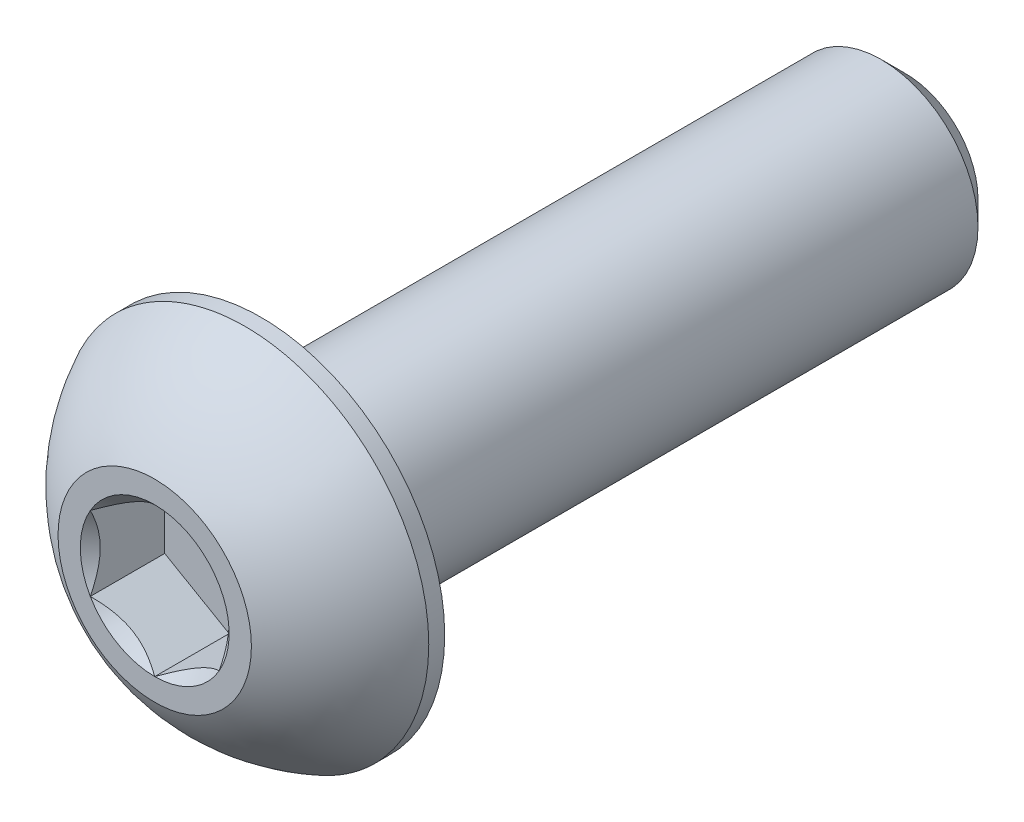
ISO-10303-21;
HEADER;
FILE_DESCRIPTION(('STEP AP214'),'2;1');
FILE_NAME('part.step','',(''),(''),'','','');
FILE_SCHEMA(('AUTOMOTIVE_DESIGN { 1 0 10303 214 1 1 1 1 }'));
ENDSEC;
DATA;
#1=APPLICATION_CONTEXT('core data for automotive mechanical design processes');
#2=APPLICATION_PROTOCOL_DEFINITION('international standard','automotive_design',2000,#1);
#3=PRODUCT_CONTEXT('',#1,'mechanical');
#4=PRODUCT('Part','Part','',(#3));
#5=PRODUCT_RELATED_PRODUCT_CATEGORY('part','',(#4));
#6=PRODUCT_DEFINITION_FORMATION('','',#4);
#7=PRODUCT_DEFINITION_CONTEXT('part definition',#1,'design');
#8=PRODUCT_DEFINITION('design','',#6,#7);
#9=PRODUCT_DEFINITION_SHAPE('','',#8);
#10=(LENGTH_UNIT() NAMED_UNIT(*) SI_UNIT(.MILLI.,.METRE.));
#11=(NAMED_UNIT(*) PLANE_ANGLE_UNIT() SI_UNIT($,.RADIAN.));
#12=(NAMED_UNIT(*) SI_UNIT($,.STERADIAN.) SOLID_ANGLE_UNIT());
#13=UNCERTAINTY_MEASURE_WITH_UNIT(LENGTH_MEASURE(1.E-05),#10,'distance_accuracy_value','');
#14=(GEOMETRIC_REPRESENTATION_CONTEXT(3) GLOBAL_UNCERTAINTY_ASSIGNED_CONTEXT((#13)) GLOBAL_UNIT_ASSIGNED_CONTEXT((#10,
#11,#12)) REPRESENTATION_CONTEXT('',''));
#15=CARTESIAN_POINT('',(0.,0.,0.));
#16=DIRECTION('',(0.,0.,1.));
#17=DIRECTION('',(1.,0.,0.));
#18=AXIS2_PLACEMENT_3D('',#15,#16,#17);
#19=CARTESIAN_POINT('',(1.,-0.57735026919,-1.155));
#20=DIRECTION('',(0.,0.,1.));
#21=DIRECTION('',(1.,0.,0.));
#22=AXIS2_PLACEMENT_3D('',#19,#20,#21);
#23=PLANE('',#22);
#24=DIRECTION('',(0.,-1.,0.));
#25=VECTOR('',#24,1.);
#26=CARTESIAN_POINT('',(-1.,0.57735026919,-1.155));
#27=LINE('',#26,#25);
#28=CARTESIAN_POINT('',(-0.999999999999868,0.57735026918977,-1.155));
#29=VERTEX_POINT('',#28);
#30=CARTESIAN_POINT('',(-1.,-0.57735026919,-1.155));
#31=VERTEX_POINT('',#30);
#32=EDGE_CURVE('E67',#29,#31,#27,.T.);
#33=ORIENTED_EDGE('',*,*,#32,.T.);
#34=DIRECTION('',(0.866025403784329,-0.50000000000019,0.));
#35=VECTOR('',#34,1.);
#36=CARTESIAN_POINT('',(-1.,-0.57735026919,-1.155));
#37=LINE('',#36,#35);
#38=CARTESIAN_POINT('',(-1.32209130071238E-13,-1.15470053837923,-1.155));
#39=VERTEX_POINT('',#38);
#40=EDGE_CURVE('E81',#31,#39,#37,.T.);
#41=ORIENTED_EDGE('',*,*,#40,.T.);
#42=DIRECTION('',(0.866025403784329,0.50000000000019,0.));
#43=VECTOR('',#42,1.);
#44=CARTESIAN_POINT('',(0.,-1.154700538379,-1.155));
#45=LINE('',#44,#43);
#46=CARTESIAN_POINT('',(0.999999999999868,-0.57735026918977,-1.155));
#47=VERTEX_POINT('',#46);
#48=EDGE_CURVE('E84',#39,#47,#45,.T.);
#49=ORIENTED_EDGE('',*,*,#48,.T.);
#50=DIRECTION('',(0.,1.,0.));
#51=VECTOR('',#50,1.);
#52=CARTESIAN_POINT('',(1.,-0.57735026919,-1.155));
#53=LINE('',#52,#51);
#54=CARTESIAN_POINT('',(1.,0.57735026919,-1.155));
#55=VERTEX_POINT('',#54);
#56=EDGE_CURVE('E94',#47,#55,#53,.T.);
#57=ORIENTED_EDGE('',*,*,#56,.T.);
#58=DIRECTION('',(-0.866025403784329,0.50000000000019,0.));
#59=VECTOR('',#58,1.);
#60=CARTESIAN_POINT('',(1.,0.57735026919,-1.155));
#61=LINE('',#60,#59);
#62=CARTESIAN_POINT('',(1.32384013380888E-13,1.15470053837923,-1.155));
#63=VERTEX_POINT('',#62);
#64=EDGE_CURVE('E156',#55,#63,#61,.T.);
#65=ORIENTED_EDGE('',*,*,#64,.T.);
#66=DIRECTION('',(-0.866025403784329,-0.50000000000019,0.));
#67=VECTOR('',#66,1.);
#68=CARTESIAN_POINT('',(0.,1.154700538379,-1.155));
#69=LINE('',#68,#67);
#70=EDGE_CURVE('E72',#63,#29,#69,.T.);
#71=ORIENTED_EDGE('',*,*,#70,.T.);
#72=EDGE_LOOP('',(#33,#41,#49,#57,#65,#71));
#73=FACE_BOUND('',#72,.T.);
#74=ADVANCED_FACE('F17',(#73),#23,.T.);
#75=CARTESIAN_POINT('',(-1.,-0.57735026919,-1.155));
#76=DIRECTION('',(-0.50000000000019,-0.866025403784329,0.));
#77=DIRECTION('',(0.866025403784329,-0.50000000000019,0.));
#78=AXIS2_PLACEMENT_3D('',#75,#76,#77);
#79=PLANE('',#78);
#80=CARTESIAN_POINT('',(-1.00000000000687,-0.577350269186032,-9.76573861725329E-12));
#81=CARTESIAN_POINT('',(-0.965629464441707,-0.597194107146782,-0.0198247003241369));
#82=CARTESIAN_POINT('',(-0.930684324301687,-0.617369693213502,-0.0384849663840303));
#83=CARTESIAN_POINT('',(-0.859427596899556,-0.658509783960715,-0.0726511231288598));
#84=CARTESIAN_POINT('',(-0.823109236818877,-0.679478198929832,-0.0881380100268031));
#85=CARTESIAN_POINT('',(-0.749874902209068,-0.721760061730749,-0.114666959659701));
#86=CARTESIAN_POINT('',(-0.712977570437581,-0.743062746161407,-0.125775687439788));
#87=CARTESIAN_POINT('',(-0.638371399378789,-0.78613663910543,-0.142891513089796));
#88=CARTESIAN_POINT('',(-0.600664836168012,-0.807906533525398,-0.148911380154949));
#89=CARTESIAN_POINT('',(-0.535672283803929,-0.845430001128142,-0.154341115227554));
#90=CARTESIAN_POINT('',(-0.50847069502453,-0.861134845732321,-0.155143433048929));
#91=CARTESIAN_POINT('',(-0.454120291097658,-0.892514066070082,-0.153791220217833));
#92=CARTESIAN_POINT('',(-0.42697148893419,-0.908188434307344,-0.15163603640589));
#93=CARTESIAN_POINT('',(-0.345912971864407,-0.954987590957718,-0.140876680236939));
#94=CARTESIAN_POINT('',(-0.292406762387295,-0.985879415402661,-0.127977491708379));
#95=CARTESIAN_POINT('',(-0.198537260412867,-1.04007499763632,-0.0968623192937564));
#96=CARTESIAN_POINT('',(-0.157732128751787,-1.06363385138517,-0.0802830121814487));
#97=CARTESIAN_POINT('',(-0.077718801117891,-1.10982956763339,-0.0429387149837531));
#98=CARTESIAN_POINT('',(-0.0385058936699848,-1.13246915030415,-0.0221873503351658));
#99=CARTESIAN_POINT('',(6.45503076175351E-12,-1.15470053838365,-9.52687762309462E-12));
#100=B_SPLINE_CURVE_WITH_KNOTS('',3,(#80,#81,#82,#83,#84,#85,#86,#87,#88,#89,#90,#91,#92,#93,
#94,#95,#96,#97,#98,#99),.UNSPECIFIED.,.F.,.F.,(4,2,2,2,2,2,2,2,2,4),(0.,0.133182946614773,
0.267141541534504,0.398973326915738,0.530473323836531,0.624596460627169,0.718740387706706,
0.907081600901655,1.05673041344688,1.20589820621635),.UNSPECIFIED.);
#101=CARTESIAN_POINT('',(-1.00000000000595,-0.577350269193433,-6.86662647432876E-12));
#102=VERTEX_POINT('',#101);
#103=CARTESIAN_POINT('',(-9.04559531445216E-12,-1.15470053838841,-4.76344114464498E-12));
#104=VERTEX_POINT('',#103);
#105=EDGE_CURVE('E20',#102,#104,#100,.T.);
#106=ORIENTED_EDGE('',*,*,#105,.T.);
#107=DIRECTION('',(0.,0.,1.));
#108=VECTOR('',#107,1.);
#109=CARTESIAN_POINT('',(0.,-1.154700538379,-1.155));
#110=LINE('',#109,#108);
#111=EDGE_CURVE('E88',#104,#39,#110,.F.);
#112=ORIENTED_EDGE('',*,*,#111,.T.);
#113=ORIENTED_EDGE('',*,*,#40,.F.);
#114=DIRECTION('',(0.,0.,1.));
#115=VECTOR('',#114,1.);
#116=CARTESIAN_POINT('',(-1.,-0.57735026919,-1.155));
#117=LINE('',#116,#115);
#118=EDGE_CURVE('E59',#31,#102,#117,.T.);
#119=ORIENTED_EDGE('',*,*,#118,.T.);
#120=EDGE_LOOP('',(#106,#112,#113,#119));
#121=FACE_BOUND('',#120,.T.);
#122=ADVANCED_FACE('F89',(#121),#79,.F.);
#123=CARTESIAN_POINT('',(0.,-1.154700538379,-1.155));
#124=DIRECTION('',(0.50000000000019,-0.866025403784329,0.));
#125=DIRECTION('',(0.866025403784329,0.50000000000019,0.));
#126=AXIS2_PLACEMENT_3D('',#123,#124,#125);
#127=PLANE('',#126);
#128=CARTESIAN_POINT('',(-7.14404093326364E-12,-1.15470053838312,-1.00471971558713E-11));
#129=CARTESIAN_POINT('',(0.0343705355580595,-1.13485670042235,-0.0198247003244728));
#130=CARTESIAN_POINT('',(0.069315675698119,-1.11468111435561,-0.0384849663844207));
#131=CARTESIAN_POINT('',(0.140572403100335,-1.07354102360835,-0.0726511231293555));
#132=CARTESIAN_POINT('',(0.176890763181059,-1.05257260863921,-0.0881380100273495));
#133=CARTESIAN_POINT('',(0.250125097790961,-1.01029074583823,-0.114666959660338));
#134=CARTESIAN_POINT('',(0.287022429562496,-0.988988061407549,-0.125775687440465));
#135=CARTESIAN_POINT('',(0.361628600621389,-0.945914168463468,-0.142891513090537));
#136=CARTESIAN_POINT('',(0.399335163832218,-0.924144274043469,-0.148911380155715));
#137=CARTESIAN_POINT('',(0.464327716196336,-0.886620806440705,-0.15434111522834));
#138=CARTESIAN_POINT('',(0.491529304975717,-0.870915961836536,-0.155143433049722));
#139=CARTESIAN_POINT('',(0.545879708902554,-0.839536741498797,-0.153791220218641));
#140=CARTESIAN_POINT('',(0.573028511066004,-0.823862373261545,-0.151636036406705));
#141=CARTESIAN_POINT('',(0.654087028135734,-0.7770632166112,-0.14087668023778));
#142=CARTESIAN_POINT('',(0.707593237612812,-0.746171392166277,-0.127977491709239));
#143=CARTESIAN_POINT('',(0.801462739587241,-0.691975809932617,-0.0968623192946334));
#144=CARTESIAN_POINT('',(0.842267871248352,-0.668416956183745,-0.0802830121823146));
#145=CARTESIAN_POINT('',(0.92228119888231,-0.622221239935498,-0.042938714984587));
#146=CARTESIAN_POINT('',(0.961494106330245,-0.599581657264713,-0.0221873503359786));
#147=CARTESIAN_POINT('',(1.00000000000671,-0.577350269185206,-1.03166856816178E-11));
#148=B_SPLINE_CURVE_WITH_KNOTS('',3,(#128,#129,#130,#131,#132,#133,#134,#135,#136,#137,#138,
#139,#140,#141,#142,#143,#144,#145,#146,#147),.UNSPECIFIED.,.F.,.F.,(4,2,2,2,2,2,2,2,2,4),(0.,
0.133182946614965,0.267141541534896,0.39897332691632,0.530473323837301,0.624596460627876,
0.718740387707351,0.907081600902173,1.05673041344751,1.2058982062171),.UNSPECIFIED.);
#149=CARTESIAN_POINT('',(1.00000000000336,-0.577350269201336,-5.15841129850177E-12));
#150=VERTEX_POINT('',#149);
#151=EDGE_CURVE('E200',#104,#150,#148,.T.);
#152=ORIENTED_EDGE('',*,*,#151,.T.);
#153=DIRECTION('',(0.,0.,-1.));
#154=VECTOR('',#153,1.);
#155=CARTESIAN_POINT('',(1.,-0.57735026919,-1.155));
#156=LINE('',#155,#154);
#157=EDGE_CURVE('E98',#150,#47,#156,.T.);
#158=ORIENTED_EDGE('',*,*,#157,.T.);
#159=ORIENTED_EDGE('',*,*,#48,.F.);
#160=ORIENTED_EDGE('',*,*,#111,.F.);
#161=EDGE_LOOP('',(#152,#158,#159,#160));
#162=FACE_BOUND('',#161,.T.);
#163=ADVANCED_FACE('F96',(#162),#127,.F.);
#164=CARTESIAN_POINT('',(1.,-0.57735026919,-1.155));
#165=DIRECTION('',(1.,0.,0.));
#166=DIRECTION('',(0.,0.,-1.));
#167=AXIS2_PLACEMENT_3D('',#164,#165,#166);
#168=PLANE('',#167);
#169=ORIENTED_EDGE('',*,*,#157,.F.);
#170=CARTESIAN_POINT('',(1.,-0.577350269197873,-9.79657883863577E-12));
#171=CARTESIAN_POINT('',(1.,-0.537921916680572,-0.0196957814667734));
#172=CARTESIAN_POINT('',(1.,-0.497838522924792,-0.0382415234641899));
#173=CARTESIAN_POINT('',(1.,-0.416089218001776,-0.0722362431308401));
#174=CARTESIAN_POINT('',(1.,-0.374414806909283,-0.0876645993592921));
#175=CARTESIAN_POINT('',(1.,-0.28986152287946,-0.114306054614917));
#176=CARTESIAN_POINT('',(1.,-0.246987267534562,-0.125533419411625));
#177=CARTESIAN_POINT('',(1.,-0.160298880506354,-0.1428184328681));
#178=CARTESIAN_POINT('',(1.,-0.116488090628363,-0.148892068105174));
#179=CARTESIAN_POINT('',(1.,-0.0604313808574838,-0.152949365561766));
#180=CARTESIAN_POINT('',(1.,-0.0483511655846584,-0.153605303607655));
#181=CARTESIAN_POINT('',(1.,-0.0241811978040213,-0.154480969382922));
#182=CARTESIAN_POINT('',(1.,-0.0120914540520388,-0.154700934074538));
#183=CARTESIAN_POINT('',(1.,0.0303471731681174,-0.154699545112393));
#184=CARTESIAN_POINT('',(1.,0.0607051197102165,-0.153310476556589));
#185=CARTESIAN_POINT('',(1.,0.121184237368537,-0.147836698539922));
#186=CARTESIAN_POINT('',(1.,0.151305228501232,-0.143750108934114));
#187=CARTESIAN_POINT('',(1.,0.241266773105827,-0.127699537859295));
#188=CARTESIAN_POINT('',(1.,0.300451693371655,-0.111947476554444));
#189=CARTESIAN_POINT('',(1.,0.396054922851829,-0.0797228164968935));
#190=CARTESIAN_POINT('',(1.,0.433252086897934,-0.0653935986061159));
#191=CARTESIAN_POINT('',(1.,0.506237961687203,-0.0343375601574046));
#192=CARTESIAN_POINT('',(1.,0.542036443001901,-0.0176338680725736));
#193=CARTESIAN_POINT('',(1.,0.577350269197935,-9.76588511529571E-12));
#194=B_SPLINE_CURVE_WITH_KNOTS('',3,(#170,#171,#172,#173,#174,#175,#176,#177,#178,#179,#180,
#181,#182,#183,#184,#185,#186,#187,#188,#189,#190,#191,#192,#193),.UNSPECIFIED.,.F.,.F.,(4,2,2,
2,2,2,2,2,2,2,2,4),(0.,0.132313199490098,0.265474890532123,0.398180195021638,0.530472334481848,
0.566760915586624,0.603029767540627,0.694057457520673,0.785148659968771,0.968083578453306,
1.08759246661553,1.20600826493605),.UNSPECIFIED.);
#195=CARTESIAN_POINT('',(1.00000000001189,0.577350269187101,-4.88292132314233E-12));
#196=VERTEX_POINT('',#195);
#197=EDGE_CURVE('E178',#150,#196,#194,.T.);
#198=ORIENTED_EDGE('',*,*,#197,.T.);
#199=DIRECTION('',(0.,0.,1.));
#200=VECTOR('',#199,1.);
#201=CARTESIAN_POINT('',(1.,0.57735026919,-1.155));
#202=LINE('',#201,#200);
#203=EDGE_CURVE('E153',#196,#55,#202,.F.);
#204=ORIENTED_EDGE('',*,*,#203,.T.);
#205=ORIENTED_EDGE('',*,*,#56,.F.);
#206=EDGE_LOOP('',(#169,#198,#204,#205));
#207=FACE_BOUND('',#206,.T.);
#208=ADVANCED_FACE('F177',(#207),#168,.F.);
#209=CARTESIAN_POINT('',(1.,0.57735026919,-1.155));
#210=DIRECTION('',(0.50000000000019,0.866025403784329,0.));
#211=DIRECTION('',(-0.866025403784329,0.50000000000019,0.));
#212=AXIS2_PLACEMENT_3D('',#209,#210,#211);
#213=PLANE('',#212);
#214=CARTESIAN_POINT('',(1.00000000000687,0.577350269186032,-9.76580806181299E-12));
#215=CARTESIAN_POINT('',(0.965629464441707,0.597194107146782,-0.0198247003241369));
#216=CARTESIAN_POINT('',(0.930684324301687,0.617369693213502,-0.0384849663840303));
#217=CARTESIAN_POINT('',(0.859427596899556,0.658509783960715,-0.0726511231288599));
#218=CARTESIAN_POINT('',(0.823109236818877,0.679478198929831,-0.0881380100268032));
#219=CARTESIAN_POINT('',(0.749874902209068,0.721760061730749,-0.114666959659701));
#220=CARTESIAN_POINT('',(0.712977570437581,0.743062746161407,-0.125775687439788));
#221=CARTESIAN_POINT('',(0.638371399378789,0.78613663910543,-0.142891513089796));
#222=CARTESIAN_POINT('',(0.600664836168013,0.807906533525398,-0.148911380154949));
#223=CARTESIAN_POINT('',(0.535672283803929,0.845430001128141,-0.154341115227554));
#224=CARTESIAN_POINT('',(0.508470695024531,0.861134845732321,-0.155143433048929));
#225=CARTESIAN_POINT('',(0.454120291097659,0.892514066070081,-0.153791220217833));
#226=CARTESIAN_POINT('',(0.426971488934191,0.908188434307343,-0.15163603640589));
#227=CARTESIAN_POINT('',(0.345912971864408,0.954987590957718,-0.140876680236939));
#228=CARTESIAN_POINT('',(0.292406762387296,0.985879415402661,-0.127977491708379));
#229=CARTESIAN_POINT('',(0.198537260412867,1.04007499763632,-0.0968623192937566));
#230=CARTESIAN_POINT('',(0.157732128751788,1.06363385138517,-0.0802830121814489));
#231=CARTESIAN_POINT('',(0.0777188011178913,1.10982956763339,-0.0429387149837533));
#232=CARTESIAN_POINT('',(0.0385058936699849,1.13246915030415,-0.0221873503351659));
#233=CARTESIAN_POINT('',(-6.4549741089323E-12,1.15470053838365,-9.52687788960817E-12));
#234=B_SPLINE_CURVE_WITH_KNOTS('',3,(#214,#215,#216,#217,#218,#219,#220,#221,#222,#223,#224,
#225,#226,#227,#228,#229,#230,#231,#232,#233),.UNSPECIFIED.,.F.,.F.,(4,2,2,2,2,2,2,2,2,4),(0.,
0.133182946614772,0.267141541534504,0.398973326915737,0.53047332383653,0.624596460627168,
0.718740387706705,0.907081600901654,1.05673041344688,1.20589820621635),.UNSPECIFIED.);
#235=CARTESIAN_POINT('',(9.0455729964461E-12,1.15470053838841,-4.7634775212635E-12));
#236=VERTEX_POINT('',#235);
#237=EDGE_CURVE('E183',#196,#236,#234,.T.);
#238=ORIENTED_EDGE('',*,*,#237,.T.);
#239=DIRECTION('',(0.,0.,1.));
#240=VECTOR('',#239,1.);
#241=CARTESIAN_POINT('',(0.,1.154700538379,-1.155));
#242=LINE('',#241,#240);
#243=EDGE_CURVE('E148',#236,#63,#242,.F.);
#244=ORIENTED_EDGE('',*,*,#243,.T.);
#245=ORIENTED_EDGE('',*,*,#64,.F.);
#246=ORIENTED_EDGE('',*,*,#203,.F.);
#247=EDGE_LOOP('',(#238,#244,#245,#246));
#248=FACE_BOUND('',#247,.T.);
#249=ADVANCED_FACE('F181',(#248),#213,.F.);
#250=CARTESIAN_POINT('',(0.,1.154700538379,-1.155));
#251=DIRECTION('',(-0.50000000000019,0.866025403784329,0.));
#252=DIRECTION('',(-0.866025403784329,-0.50000000000019,0.));
#253=AXIS2_PLACEMENT_3D('',#250,#251,#252);
#254=PLANE('',#253);
#255=CARTESIAN_POINT('',(7.14420501628805E-12,1.15470053838312,-1.0047064224806E-11));
#256=CARTESIAN_POINT('',(-0.0343705355580593,1.13485670042235,-0.0198247003244726));
#257=CARTESIAN_POINT('',(-0.0693156756981189,1.11468111435561,-0.0384849663844205));
#258=CARTESIAN_POINT('',(-0.140572403100335,1.07354102360835,-0.0726511231293555));
#259=CARTESIAN_POINT('',(-0.176890763181059,1.05257260863921,-0.0881380100273495));
#260=CARTESIAN_POINT('',(-0.250125097790961,1.01029074583823,-0.114666959660338));
#261=CARTESIAN_POINT('',(-0.287022429562496,0.988988061407549,-0.125775687440465));
#262=CARTESIAN_POINT('',(-0.361628600621389,0.945914168463468,-0.142891513090537));
#263=CARTESIAN_POINT('',(-0.399335163832218,0.924144274043469,-0.148911380155715));
#264=CARTESIAN_POINT('',(-0.464327716196337,0.886620806440705,-0.15434111522834));
#265=CARTESIAN_POINT('',(-0.491529304975717,0.870915961836536,-0.155143433049722));
#266=CARTESIAN_POINT('',(-0.545879708902554,0.839536741498797,-0.15379122021864));
#267=CARTESIAN_POINT('',(-0.573028511066004,0.823862373261544,-0.151636036406705));
#268=CARTESIAN_POINT('',(-0.654087028135734,0.7770632166112,-0.14087668023778));
#269=CARTESIAN_POINT('',(-0.707593237612813,0.746171392166277,-0.127977491709239));
#270=CARTESIAN_POINT('',(-0.801462739587241,0.691975809932617,-0.0968623192946332));
#271=CARTESIAN_POINT('',(-0.842267871248352,0.668416956183744,-0.0802830121823144));
#272=CARTESIAN_POINT('',(-0.92228119888231,0.622221239935498,-0.0429387149845868));
#273=CARTESIAN_POINT('',(-0.961494106330246,0.599581657264713,-0.0221873503359784));
#274=CARTESIAN_POINT('',(-1.00000000000671,0.577350269185206,-1.03166853606373E-11));
#275=B_SPLINE_CURVE_WITH_KNOTS('',3,(#255,#256,#257,#258,#259,#260,#261,#262,#263,#264,#265,
#266,#267,#268,#269,#270,#271,#272,#273,#274),.UNSPECIFIED.,.F.,.F.,(4,2,2,2,2,2,2,2,2,4),(0.,
0.133182946614965,0.267141541534896,0.39897332691632,0.530473323837302,0.624596460627877,
0.718740387707352,0.907081600902174,1.05673041344751,1.2058982062171),.UNSPECIFIED.);
#276=CARTESIAN_POINT('',(-1.00000000000336,0.577350269201337,-5.15820147295835E-12));
#277=VERTEX_POINT('',#276);
#278=EDGE_CURVE('E40',#236,#277,#275,.T.);
#279=ORIENTED_EDGE('',*,*,#278,.T.);
#280=DIRECTION('',(0.,0.,1.));
#281=VECTOR('',#280,1.);
#282=CARTESIAN_POINT('',(-1.,0.57735026919,-1.155));
#283=LINE('',#282,#281);
#284=EDGE_CURVE('E141',#277,#29,#283,.F.);
#285=ORIENTED_EDGE('',*,*,#284,.T.);
#286=ORIENTED_EDGE('',*,*,#70,.F.);
#287=ORIENTED_EDGE('',*,*,#243,.F.);
#288=EDGE_LOOP('',(#279,#285,#286,#287));
#289=FACE_BOUND('',#288,.T.);
#290=ADVANCED_FACE('F185',(#289),#254,.F.);
#291=CARTESIAN_POINT('',(-1.,0.57735026919,-1.155));
#292=DIRECTION('',(-1.,0.,0.));
#293=DIRECTION('',(0.,-1.,0.));
#294=AXIS2_PLACEMENT_3D('',#291,#292,#293);
#295=PLANE('',#294);
#296=CARTESIAN_POINT('',(-1.,0.577350269197874,-9.79651308430195E-12));
#297=CARTESIAN_POINT('',(-1.,0.537662593288858,-0.019824700325185));
#298=CARTESIAN_POINT('',(-1.,0.497311421167976,-0.0384849663866108));
#299=CARTESIAN_POINT('',(-1.,0.41503123969865,-0.072651123135888));
#300=CARTESIAN_POINT('',(-1.,0.373094409772957,-0.0881380100367498));
#301=CARTESIAN_POINT('',(-1.,0.288530684195536,-0.114666959677174));
#302=CARTESIAN_POINT('',(-1.,0.24592531534609,-0.125775687461818));
#303=CARTESIAN_POINT('',(-1.,0.15977752948117,-0.142891513122503));
#304=CARTESIAN_POINT('',(-1.,0.116237740652492,-0.148911380193773));
#305=CARTESIAN_POINT('',(-1.,0.0411908054731722,-0.15434111527724));
#306=CARTESIAN_POINT('',(-1.,0.00978111627999076,-0.15514343310381));
#307=CARTESIAN_POINT('',(-1.,-0.052977324365743,-0.153791220284784));
#308=CARTESIAN_POINT('',(-1.,-0.0843260608256576,-0.151636036479717));
#309=CARTESIAN_POINT('',(-1.,-0.177924374083574,-0.140876680333189));
#310=CARTESIAN_POINT('',(-1.,-0.239708022946268,-0.12797749182197));
#311=CARTESIAN_POINT('',(-1.,-0.348099187444657,-0.0968623194171545));
#312=CARTESIAN_POINT('',(-1.,-0.395216894997395,-0.0802830122879878));
#313=CARTESIAN_POINT('',(-1.,-0.487608327599248,-0.042938715044657));
#314=CARTESIAN_POINT('',(-1.,-0.532887492991187,-0.0221873503672994));
#315=CARTESIAN_POINT('',(-1.,-0.577350269197935,-9.76605982393867E-12));
#316=B_SPLINE_CURVE_WITH_KNOTS('',3,(#296,#297,#298,#299,#300,#301,#302,#303,#304,#305,#306,
#307,#308,#309,#310,#311,#312,#313,#314,#315),.UNSPECIFIED.,.F.,.F.,(4,2,2,2,2,2,2,2,2,4),(0.,
0.133182946582634,0.267141541470225,0.398973326820606,0.53047332371057,0.624596460456231,
0.718740387490737,0.907081600595523,1.0567304133122,1.20589820625371),.UNSPECIFIED.);
#317=EDGE_CURVE('E190',#277,#102,#316,.T.);
#318=ORIENTED_EDGE('',*,*,#317,.T.);
#319=ORIENTED_EDGE('',*,*,#118,.F.);
#320=ORIENTED_EDGE('',*,*,#32,.F.);
#321=ORIENTED_EDGE('',*,*,#284,.F.);
#322=EDGE_LOOP('',(#318,#319,#320,#321));
#323=FACE_BOUND('',#322,.T.);
#324=ADVANCED_FACE('F188',(#323),#295,.F.);
#325=CARTESIAN_POINT('',(0.,0.,0.));
#326=DIRECTION('',(0.,0.,1.));
#327=DIRECTION('',(1.,0.,0.));
#328=AXIS2_PLACEMENT_3D('',#325,#326,#327);
#329=CONICAL_SURFACE('',#328,1.15470053839317,0.785398163579885);
#330=ORIENTED_EDGE('',*,*,#105,.F.);
#331=CARTESIAN_POINT('',(0.,0.,0.));
#332=DIRECTION('',(0.,0.,1.));
#333=DIRECTION('',(1.,0.,0.));
#334=AXIS2_PLACEMENT_3D('',#331,#332,#333);
#335=CIRCLE('',#334,1.15470053839317);
#336=EDGE_CURVE('E194',#102,#104,#335,.T.);
#337=ORIENTED_EDGE('',*,*,#336,.T.);
#338=EDGE_LOOP('',(#330,#337));
#339=FACE_BOUND('',#338,.T.);
#340=ADVANCED_FACE('F197',(#339),#329,.F.);
#341=CARTESIAN_POINT('',(0.,0.,0.));
#342=DIRECTION('',(0.,0.,1.));
#343=DIRECTION('',(1.,0.,0.));
#344=AXIS2_PLACEMENT_3D('',#341,#342,#343);
#345=CONICAL_SURFACE('',#344,1.15470053839317,0.785398163579885);
#346=ORIENTED_EDGE('',*,*,#151,.F.);
#347=CARTESIAN_POINT('',(0.,0.,0.));
#348=DIRECTION('',(0.,0.,1.));
#349=DIRECTION('',(1.,0.,0.));
#350=AXIS2_PLACEMENT_3D('',#347,#348,#349);
#351=CIRCLE('',#350,1.15470053839317);
#352=EDGE_CURVE('E208',#104,#150,#351,.T.);
#353=ORIENTED_EDGE('',*,*,#352,.T.);
#354=EDGE_LOOP('',(#346,#353));
#355=FACE_BOUND('',#354,.T.);
#356=ADVANCED_FACE('F266',(#355),#345,.F.);
#357=CARTESIAN_POINT('',(0.,0.,0.));
#358=DIRECTION('',(0.,0.,1.));
#359=DIRECTION('',(1.,0.,0.));
#360=AXIS2_PLACEMENT_3D('',#357,#358,#359);
#361=CONICAL_SURFACE('',#360,1.15470053839317,0.785398163580073);
#362=ORIENTED_EDGE('',*,*,#197,.F.);
#363=CARTESIAN_POINT('',(0.,0.,0.));
#364=DIRECTION('',(0.,0.,1.));
#365=DIRECTION('',(1.,0.,0.));
#366=AXIS2_PLACEMENT_3D('',#363,#364,#365);
#367=CIRCLE('',#366,1.15470053839317);
#368=EDGE_CURVE('E210',#150,#196,#367,.T.);
#369=ORIENTED_EDGE('',*,*,#368,.T.);
#370=EDGE_LOOP('',(#362,#369));
#371=FACE_BOUND('',#370,.T.);
#372=ADVANCED_FACE('F238',(#371),#361,.F.);
#373=CARTESIAN_POINT('',(0.,0.,0.));
#374=DIRECTION('',(0.,0.,1.));
#375=DIRECTION('',(1.,0.,0.));
#376=AXIS2_PLACEMENT_3D('',#373,#374,#375);
#377=CONICAL_SURFACE('',#376,1.15470053839317,0.785398163579885);
#378=ORIENTED_EDGE('',*,*,#237,.F.);
#379=CARTESIAN_POINT('',(0.,0.,0.));
#380=DIRECTION('',(0.,0.,1.));
#381=DIRECTION('',(1.,0.,0.));
#382=AXIS2_PLACEMENT_3D('',#379,#380,#381);
#383=CIRCLE('',#382,1.15470053839317);
#384=EDGE_CURVE('E435',#196,#236,#383,.T.);
#385=ORIENTED_EDGE('',*,*,#384,.T.);
#386=EDGE_LOOP('',(#378,#385));
#387=FACE_BOUND('',#386,.T.);
#388=ADVANCED_FACE('F233',(#387),#377,.F.);
#389=CARTESIAN_POINT('',(0.,0.,0.));
#390=DIRECTION('',(0.,0.,1.));
#391=DIRECTION('',(1.,0.,0.));
#392=AXIS2_PLACEMENT_3D('',#389,#390,#391);
#393=CONICAL_SURFACE('',#392,1.15470053839317,0.785398163579885);
#394=ORIENTED_EDGE('',*,*,#278,.F.);
#395=CARTESIAN_POINT('',(0.,0.,0.));
#396=DIRECTION('',(0.,0.,1.));
#397=DIRECTION('',(1.,0.,0.));
#398=AXIS2_PLACEMENT_3D('',#395,#396,#397);
#399=CIRCLE('',#398,1.15470053839317);
#400=EDGE_CURVE('E204',#236,#277,#399,.T.);
#401=ORIENTED_EDGE('',*,*,#400,.T.);
#402=EDGE_LOOP('',(#394,#401));
#403=FACE_BOUND('',#402,.T.);
#404=ADVANCED_FACE('F229',(#403),#393,.F.);
#405=CARTESIAN_POINT('',(0.,0.,0.));
#406=DIRECTION('',(0.,0.,1.));
#407=DIRECTION('',(1.,0.,0.));
#408=AXIS2_PLACEMENT_3D('',#405,#406,#407);
#409=CONICAL_SURFACE('',#408,1.15470053839317,0.785398163397448);
#410=ORIENTED_EDGE('',*,*,#317,.F.);
#411=CARTESIAN_POINT('',(0.,0.,0.));
#412=DIRECTION('',(0.,0.,1.));
#413=DIRECTION('',(1.,0.,0.));
#414=AXIS2_PLACEMENT_3D('',#411,#412,#413);
#415=CIRCLE('',#414,1.15470053839317);
#416=EDGE_CURVE('E126',#277,#102,#415,.T.);
#417=ORIENTED_EDGE('',*,*,#416,.T.);
#418=EDGE_LOOP('',(#410,#417));
#419=FACE_BOUND('',#418,.T.);
#420=ADVANCED_FACE('F201',(#419),#409,.F.);
#421=CARTESIAN_POINT('',(0.,-1.5,0.));
#422=DIRECTION('',(0.,0.,-1.));
#423=DIRECTION('',(-1.,0.,0.));
#424=AXIS2_PLACEMENT_3D('',#421,#422,#423);
#425=PLANE('',#424);
#426=CARTESIAN_POINT('',(0.,1.4999999999997,0.));
#427=CARTESIAN_POINT('',(0.0841929852785183,1.49999523298749,-3.34372377836952E-13));
#428=CARTESIAN_POINT('',(0.168535810228311,1.49287252863936,-2.7521647712663E-13));
#429=CARTESIAN_POINT('',(0.293182657211703,1.47167805289189,1.3796995028E-13));
#430=CARTESIAN_POINT('',(0.334473199577849,1.46284300915027,3.30239382128238E-13));
#431=CARTESIAN_POINT('',(0.416204028669607,1.44171955637725,-3.30507932164241E-13));
#432=CARTESIAN_POINT('',(0.456643596663882,1.42942834491831,-1.18437483017832E-12));
#433=CARTESIAN_POINT('',(0.576047935259006,1.38753954371022,-1.95469001677447E-12));
#434=CARTESIAN_POINT('',(0.653299317753806,1.35289238237987,0.));
#435=CARTESIAN_POINT('',(0.800882715055075,1.2711035428122,0.));
#436=CARTESIAN_POINT('',(0.871214466687618,1.22396138960526,-1.58504746267223E-12));
#437=CARTESIAN_POINT('',(0.969994722226602,1.14494365039831,-1.00266079599529E-12));
#438=CARTESIAN_POINT('',(1.00182052098066,1.11719945487035,-2.90612723539737E-13));
#439=CARTESIAN_POINT('',(1.06299428690711,1.05915984678984,2.90332529103582E-13));
#440=CARTESIAN_POINT('',(1.09234461349752,1.02886691978539,1.60041971832537E-13));
#441=CARTESIAN_POINT('',(1.17642545961865,0.934407212606419,-3.19981259740426E-13));
#442=CARTESIAN_POINT('',(1.22720721203152,0.866642380150746,-7.58891835203658E-13));
#443=CARTESIAN_POINT('',(1.31664307592529,0.723585814714599,-6.35828160076828E-13));
#444=CARTESIAN_POINT('',(1.35529764470391,0.648294365692649,0.));
#445=CARTESIAN_POINT('',(1.4194248765472,0.492282212248787,0.));
#446=CARTESIAN_POINT('',(1.44489768039927,0.411561565823642,-3.40252692246258E-13));
#447=CARTESIAN_POINT('',(1.48192791686692,0.2469913350149,-3.9873966469137E-13));
#448=CARTESIAN_POINT('',(1.49348527516813,0.163141733923825,0.));
#449=CARTESIAN_POINT('',(1.50235991721243,-0.00530769676232365,0.));
#450=CARTESIAN_POINT('',(1.49967720095553,-0.0899075263573963,-2.26423793491947E-13));
#451=CARTESIAN_POINT('',(1.48014450079133,-0.257457736460436,-2.5582925431134E-13));
#452=CARTESIAN_POINT('',(1.4632945925426,-0.340408125774663,0.));
#453=CARTESIAN_POINT('',(1.41591564666602,-0.502294905264721,0.));
#454=CARTESIAN_POINT('',(1.38538646293602,-0.581231252558361,-1.92895009764747E-13));
#455=CARTESIAN_POINT('',(1.31147765738789,-0.732893519214398,-2.44256274693858E-13));
#456=CARTESIAN_POINT('',(1.26809755096608,-0.805619204241696,0.));
#457=CARTESIAN_POINT('',(1.19440770794583,-0.908390951334067,0.));
#458=CARTESIAN_POINT('',(1.16840295086896,-0.941600222732744,0.));
#459=CARTESIAN_POINT('',(1.1136664630986,-1.00574648256377,0.));
#460=CARTESIAN_POINT('',(1.08493212487477,-1.03668124712827,-2.34470718162852E-13));
#461=CARTESIAN_POINT('',(0.995001651880901,-1.12564108087846,-4.1560936597759E-13));
#462=CARTESIAN_POINT('',(0.930012804684456,-1.17991250647971,-1.19177402350476E-13));
#463=CARTESIAN_POINT('',(0.791840538416899,-1.27675618604262,1.1917287160611E-13));
#464=CARTESIAN_POINT('',(0.718657430971176,-1.31932888469101,0.));
#465=CARTESIAN_POINT('',(0.604315651825829,-1.37353243885433,0.));
#466=CARTESIAN_POINT('',(0.565391476728731,-1.3900048743667,0.));
#467=CARTESIAN_POINT('',(0.486332690241005,-1.4195994171101,0.));
#468=CARTESIAN_POINT('',(0.446199088073462,-1.4327242357326,2.17175735578792E-13));
#469=CARTESIAN_POINT('',(0.324469325673434,-1.46689889317323,-4.33212744817867E-13));
#470=CARTESIAN_POINT('',(0.241341846946312,-1.4828446549364,-2.34817936894382E-12));
#471=CARTESIAN_POINT('',(0.13143379542977,-1.49446404091643,-8.91619380219685E-13));
#472=CARTESIAN_POINT('',(0.10519357862443,-1.49653823375251,-2.48892278830662E-13));
#473=CARTESIAN_POINT('',(0.0526404585365036,-1.49930695862807,2.48892278830824E-13));
#474=CARTESIAN_POINT('',(0.0263275552539165,-1.50000149066756,1.03949735102774E-13));
#475=CARTESIAN_POINT('',(-0.0841929852785164,-1.49999523298749,-3.39703440262625E-13));
#476=CARTESIAN_POINT('',(-0.168535810228309,-1.49287252863935,-2.76195901933568E-13));
#477=CARTESIAN_POINT('',(-0.293182657211701,-1.47167805289188,1.38460949922634E-13));
#478=CARTESIAN_POINT('',(-0.334473199577848,-1.46284300915027,3.30373890351253E-13));
#479=CARTESIAN_POINT('',(-0.416204028669606,-1.44171955637725,-3.30642549769086E-13));
#480=CARTESIAN_POINT('',(-0.456643596663881,-1.42942834491831,-1.18442172101198E-12));
#481=CARTESIAN_POINT('',(-0.576047935259005,-1.38753954371021,-1.9545964586302E-12));
#482=CARTESIAN_POINT('',(-0.653299317753803,-1.35289238237986,0.));
#483=CARTESIAN_POINT('',(-0.800882715055073,-1.2711035428122,0.));
#484=CARTESIAN_POINT('',(-0.871214466687618,-1.22396138960526,-1.58505210401777E-12));
#485=CARTESIAN_POINT('',(-0.969994722226603,-1.1449436503983,-1.00265847228157E-12));
#486=CARTESIAN_POINT('',(-1.00182052098066,-1.11719945487034,-2.90611903245851E-13));
#487=CARTESIAN_POINT('',(-1.06299428690711,-1.05915984678984,2.90331709600583E-13));
#488=CARTESIAN_POINT('',(-1.09234461349752,-1.02886691978539,1.60041014635852E-13));
#489=CARTESIAN_POINT('',(-1.17642545961865,-0.934407212606415,-3.199793459612E-13));
#490=CARTESIAN_POINT('',(-1.22720721203152,-0.866642380150742,-7.5888363089322E-13));
#491=CARTESIAN_POINT('',(-1.31664307592529,-0.723585814714594,-6.35836364077858E-13));
#492=CARTESIAN_POINT('',(-1.35529764470391,-0.648294365692644,0.));
#493=CARTESIAN_POINT('',(-1.4194248765472,-0.492282212248783,0.));
#494=CARTESIAN_POINT('',(-1.44489768039927,-0.411561565823638,-3.40137291050541E-13));
#495=CARTESIAN_POINT('',(-1.48192791686692,-0.246991335014897,-3.98855066503375E-13));
#496=CARTESIAN_POINT('',(-1.49348527516813,-0.163141733923821,0.));
#497=CARTESIAN_POINT('',(-1.50235991721243,0.00530769676232734,0.));
#498=CARTESIAN_POINT('',(-1.49967720095553,0.0899075263574002,-2.24816368383347E-13));
#499=CARTESIAN_POINT('',(-1.48014450079133,0.257457736460439,-2.53967233147807E-13));
#500=CARTESIAN_POINT('',(-1.4632945925426,0.340408125774666,0.));
#501=CARTESIAN_POINT('',(-1.41591564666602,0.502294905264724,0.));
#502=CARTESIAN_POINT('',(-1.38538646293602,0.581231252558366,-1.94792649253712E-13));
#503=CARTESIAN_POINT('',(-1.31147765738789,0.732893519214403,-2.4582807601256E-13));
#504=CARTESIAN_POINT('',(-1.26809755096608,0.805619204241699,0.));
#505=CARTESIAN_POINT('',(-1.19440770794583,0.90839095133407,0.));
#506=CARTESIAN_POINT('',(-1.16840295086896,0.941600222732748,0.));
#507=CARTESIAN_POINT('',(-1.1136664630986,1.00574648256377,0.));
#508=CARTESIAN_POINT('',(-1.08493212487477,1.03668124712827,-2.34483426037705E-13));
#509=CARTESIAN_POINT('',(-0.995001651880901,1.12564108087847,-4.15583983488427E-13));
#510=CARTESIAN_POINT('',(-0.930012804684457,1.17991250647971,-1.19181865802332E-13));
#511=CARTESIAN_POINT('',(-0.7918405384169,1.27675618604263,1.1917733488828E-13));
#512=CARTESIAN_POINT('',(-0.718657430971176,1.31932888469101,0.));
#513=CARTESIAN_POINT('',(-0.604315651825828,1.37353243885434,0.));
#514=CARTESIAN_POINT('',(-0.56539147672873,1.3900048743667,0.));
#515=CARTESIAN_POINT('',(-0.486332690241004,1.41959941711011,0.));
#516=CARTESIAN_POINT('',(-0.446199088073461,1.4327242357326,2.17409533115118E-13));
#517=CARTESIAN_POINT('',(-0.324469325673433,1.46689889317323,-4.33679114010416E-13));
#518=CARTESIAN_POINT('',(-0.24134184694631,1.4828446549364,-2.35071849705896E-12));
#519=CARTESIAN_POINT('',(-0.131433795429768,1.49446404091643,-8.9310256245961E-13));
#520=CARTESIAN_POINT('',(-0.105193578624429,1.49653823375251,-2.49842578333873E-13));
#521=CARTESIAN_POINT('',(-0.0526404585365017,1.49930695862808,2.49842578334035E-13));
#522=CARTESIAN_POINT('',(-0.0263275552539146,1.50000149066756,1.06267750875694E-13));
#523=CARTESIAN_POINT('',(0.,1.4999999999997,0.));
#524=B_SPLINE_CURVE_WITH_KNOTS('',3,(#426,#427,#428,#429,#430,#431,#432,#433,#434,#435,#436,
#437,#438,#439,#440,#441,#442,#443,#444,#445,#446,#447,#448,#449,#450,#451,#452,#453,#454,#455,
#456,#457,#458,#459,#460,#461,#462,#463,#464,#465,#466,#467,#468,#469,#470,#471,#472,#473,#474,
#475,#476,#477,#478,#479,#480,#481,#482,#483,#484,#485,#486,#487,#488,#489,#490,#491,#492,#493,
#494,#495,#496,#497,#498,#499,#500,#501,#502,#503,#504,#505,#506,#507,#508,#509,#510,#511,#512,
#513,#514,#515,#516,#517,#518,#519,#520,#521,#522,#523),.UNSPECIFIED.,.T.,.F.,(4,2,2,2,2,2,2,2,
2,2,2,2,2,2,2,2,2,2,2,2,2,2,2,2,2,2,2,2,2,2,2,2,2,2,2,2,2,2,2,2,2,2,2,2,2,2,2,2,4),(0.,
0.252456446609038,0.37901646856037,0.505679408880287,0.758401502248201,1.01113320366849,
1.13766464085115,1.26407408267082,1.51681186122597,1.76954010827641,2.02226565601554,
2.27499255341028,2.527719450805,2.78044499854396,3.03317324559433,3.28591102414941,
3.41232046596892,3.53885190315147,3.79158360457207,4.04430569794022,4.17096863826039,
4.29752866021205,4.54998510682091,4.62892946335263,4.70787381988441,4.96033026649345,
5.08689028844478,5.2135532287647,5.46627532213261,5.7190070235529,5.84553846073556,
5.97194790255523,6.22468568111038,6.47741392816082,6.73013947589995,6.98286637329469,
7.2355932706894,7.48831881842837,7.74104706547874,7.99378484403382,8.12019428585334,
8.24672572303588,8.49945742445648,8.75217951782463,8.8788424581448,9.00540248009646,
9.25785892670532,9.33680328323705,9.41574763976882),.UNSPECIFIED.);
#525=CARTESIAN_POINT('',(0.,1.4999999999997,0.));
#526=VERTEX_POINT('',#525);
#527=EDGE_CURVE('E118',#526,#526,#524,.T.);
#528=ORIENTED_EDGE('',*,*,#527,.F.);
#529=EDGE_LOOP('',(#528));
#530=FACE_BOUND('',#529,.T.);
#531=ORIENTED_EDGE('',*,*,#400,.F.);
#532=ORIENTED_EDGE('',*,*,#384,.F.);
#533=ORIENTED_EDGE('',*,*,#368,.F.);
#534=ORIENTED_EDGE('',*,*,#352,.F.);
#535=ORIENTED_EDGE('',*,*,#336,.F.);
#536=ORIENTED_EDGE('',*,*,#416,.F.);
#537=EDGE_LOOP('',(#531,#532,#533,#534,#535,#536));
#538=FACE_BOUND('',#537,.T.);
#539=ADVANCED_FACE('F128',(#530,#538),#425,.F.);
#540=CARTESIAN_POINT('',(0.,0.,-2.794832887701));
#541=DIRECTION('',(0.,-1.,0.));
#542=DIRECTION('',(0.,0.,-1.));
#543=AXIS2_PLACEMENT_3D('',#540,#541,#542);
#544=SPHERICAL_SURFACE('',#543,3.17192226736);
#545=ORIENTED_EDGE('',*,*,#527,.T.);
#546=EDGE_LOOP('',(#545));
#547=FACE_BOUND('',#546,.T.);
#548=CARTESIAN_POINT('',(0.,0.,-1.4025));
#549=DIRECTION('',(0.,0.,1.));
#550=DIRECTION('',(1.,0.,0.));
#551=AXIS2_PLACEMENT_3D('',#548,#549,#550);
#552=CIRCLE('',#551,2.85);
#553=CARTESIAN_POINT('',(2.85,0.,-1.4025));
#554=VERTEX_POINT('',#553);
#555=EDGE_CURVE('E115',#554,#554,#552,.F.);
#556=ORIENTED_EDGE('',*,*,#555,.F.);
#557=EDGE_LOOP('',(#556));
#558=FACE_BOUND('',#557,.T.);
#559=ADVANCED_FACE('F131',(#547,#558),#544,.T.);
#560=CARTESIAN_POINT('',(0.,0.,0.));
#561=DIRECTION('',(0.,0.,1.));
#562=DIRECTION('',(1.,0.,0.));
#563=AXIS2_PLACEMENT_3D('',#560,#561,#562);
#564=CYLINDRICAL_SURFACE('',#563,2.85);
#565=ORIENTED_EDGE('',*,*,#555,.T.);
#566=EDGE_LOOP('',(#565));
#567=FACE_BOUND('',#566,.T.);
#568=CARTESIAN_POINT('',(0.,0.,-1.65));
#569=DIRECTION('',(0.,0.,1.));
#570=DIRECTION('',(1.,0.,0.));
#571=AXIS2_PLACEMENT_3D('',#568,#569,#570);
#572=CIRCLE('',#571,2.85);
#573=CARTESIAN_POINT('',(2.85,0.,-1.65));
#574=VERTEX_POINT('',#573);
#575=EDGE_CURVE('E112',#574,#574,#572,.T.);
#576=ORIENTED_EDGE('',*,*,#575,.T.);
#577=EDGE_LOOP('',(#576));
#578=FACE_BOUND('',#577,.T.);
#579=ADVANCED_FACE('F136',(#567,#578),#564,.T.);
#580=CARTESIAN_POINT('',(0.,-1.5,-11.65));
#581=DIRECTION('',(0.,0.,-1.));
#582=DIRECTION('',(0.,1.,0.));
#583=AXIS2_PLACEMENT_3D('',#580,#581,#582);
#584=PLANE('',#583);
#585=CARTESIAN_POINT('',(0.,0.,-11.6500000000315));
#586=DIRECTION('',(0.,0.,1.));
#587=DIRECTION('',(1.,0.,0.));
#588=AXIS2_PLACEMENT_3D('',#585,#586,#587);
#589=CIRCLE('',#588,1.12499999994498);
#590=CARTESIAN_POINT('',(1.12499999994498,0.,-11.6500000000315));
#591=VERTEX_POINT('',#590);
#592=EDGE_CURVE('E109',#591,#591,#589,.T.);
#593=ORIENTED_EDGE('',*,*,#592,.F.);
#594=EDGE_LOOP('',(#593));
#595=FACE_BOUND('',#594,.T.);
#596=ADVANCED_FACE('F290',(#595),#584,.T.);
#597=CARTESIAN_POINT('',(0.,-2.85,-1.65));
#598=DIRECTION('',(0.,0.,1.));
#599=DIRECTION('',(1.,0.,0.));
#600=AXIS2_PLACEMENT_3D('',#597,#598,#599);
#601=PLANE('',#600);
#602=ORIENTED_EDGE('',*,*,#575,.F.);
#603=EDGE_LOOP('',(#602));
#604=FACE_BOUND('',#603,.T.);
#605=CARTESIAN_POINT('',(0.,0.,-1.65));
#606=DIRECTION('',(0.,0.,-1.));
#607=DIRECTION('',(0.,1.,0.));
#608=AXIS2_PLACEMENT_3D('',#605,#606,#607);
#609=CIRCLE('',#608,1.5);
#610=CARTESIAN_POINT('',(0.,1.5,-1.65));
#611=VERTEX_POINT('',#610);
#612=EDGE_CURVE('E31',#611,#611,#609,.T.);
#613=ORIENTED_EDGE('',*,*,#612,.F.);
#614=EDGE_LOOP('',(#613));
#615=FACE_BOUND('',#614,.T.);
#616=ADVANCED_FACE('F284',(#604,#615),#601,.F.);
#617=CARTESIAN_POINT('',(0.,0.,-11.2750000000119));
#618=DIRECTION('',(0.,0.,1.));
#619=DIRECTION('',(1.,0.,0.));
#620=AXIS2_PLACEMENT_3D('',#617,#618,#619);
#621=CONICAL_SURFACE('',#620,1.49999999996453,0.785398163397448);
#622=CARTESIAN_POINT('',(0.,0.,-11.275));
#623=DIRECTION('',(0.,0.,-1.));
#624=DIRECTION('',(0.,1.,0.));
#625=AXIS2_PLACEMENT_3D('',#622,#623,#624);
#626=CIRCLE('',#625,1.5);
#627=CARTESIAN_POINT('',(0.,1.5,-11.275));
#628=VERTEX_POINT('',#627);
#629=EDGE_CURVE('E11',#628,#628,#626,.F.);
#630=ORIENTED_EDGE('',*,*,#629,.F.);
#631=EDGE_LOOP('',(#630));
#632=FACE_BOUND('',#631,.T.);
#633=ORIENTED_EDGE('',*,*,#592,.T.);
#634=EDGE_LOOP('',(#633));
#635=FACE_BOUND('',#634,.T.);
#636=ADVANCED_FACE('F278',(#632,#635),#621,.T.);
#637=CARTESIAN_POINT('',(0.,0.,-11.65));
#638=DIRECTION('',(0.,0.,-1.));
#639=DIRECTION('',(0.,1.,0.));
#640=AXIS2_PLACEMENT_3D('',#637,#638,#639);
#641=CYLINDRICAL_SURFACE('',#640,1.5);
#642=ORIENTED_EDGE('',*,*,#629,.T.);
#643=EDGE_LOOP('',(#642));
#644=FACE_BOUND('',#643,.T.);
#645=ORIENTED_EDGE('',*,*,#612,.T.);
#646=EDGE_LOOP('',(#645));
#647=FACE_BOUND('',#646,.T.);
#648=ADVANCED_FACE('F276',(#644,#647),#641,.T.);
#649=CLOSED_SHELL('',(#74,#122,#163,#208,#249,#290,#324,#340,#356,#372,#388,#404,#420,#539,#559,
#579,#596,#616,#636,#648));
#650=MANIFOLD_SOLID_BREP('B1',#649);
#651=ADVANCED_BREP_SHAPE_REPRESENTATION('',(#18,#650),#14);
#652=SHAPE_DEFINITION_REPRESENTATION(#9,#651);
ENDSEC;
END-ISO-10303-21;
